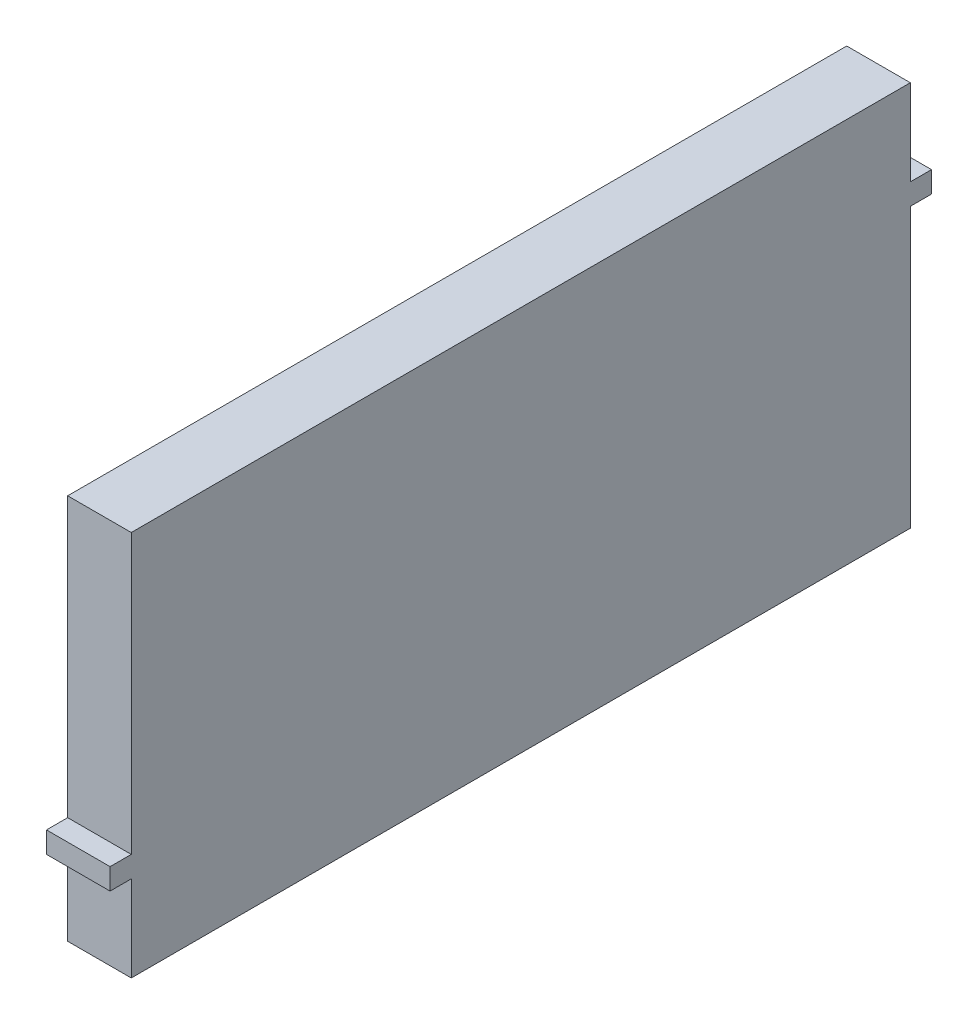
ISO-10303-21;
HEADER;
FILE_DESCRIPTION(('STEP AP214'),'2;1');
FILE_NAME('part.step','',(''),(''),'','','');
FILE_SCHEMA(('AUTOMOTIVE_DESIGN { 1 0 10303 214 1 1 1 1 }'));
ENDSEC;
DATA;
#1=APPLICATION_CONTEXT('core data for automotive mechanical design processes');
#2=APPLICATION_PROTOCOL_DEFINITION('international standard','automotive_design',2000,#1);
#3=PRODUCT_CONTEXT('',#1,'mechanical');
#4=PRODUCT('Part','Part','',(#3));
#5=PRODUCT_RELATED_PRODUCT_CATEGORY('part','',(#4));
#6=PRODUCT_DEFINITION_FORMATION('','',#4);
#7=PRODUCT_DEFINITION_CONTEXT('part definition',#1,'design');
#8=PRODUCT_DEFINITION('design','',#6,#7);
#9=PRODUCT_DEFINITION_SHAPE('','',#8);
#10=(LENGTH_UNIT() NAMED_UNIT(*) SI_UNIT(.MILLI.,.METRE.));
#11=(NAMED_UNIT(*) PLANE_ANGLE_UNIT() SI_UNIT($,.RADIAN.));
#12=(NAMED_UNIT(*) SI_UNIT($,.STERADIAN.) SOLID_ANGLE_UNIT());
#13=UNCERTAINTY_MEASURE_WITH_UNIT(LENGTH_MEASURE(1.E-05),#10,'distance_accuracy_value','');
#14=(GEOMETRIC_REPRESENTATION_CONTEXT(3) GLOBAL_UNCERTAINTY_ASSIGNED_CONTEXT((#13)) GLOBAL_UNIT_ASSIGNED_CONTEXT((#10,
#11,#12)) REPRESENTATION_CONTEXT('',''));
#15=CARTESIAN_POINT('',(0.,0.,0.));
#16=DIRECTION('',(0.,0.,1.));
#17=DIRECTION('',(1.,0.,0.));
#18=AXIS2_PLACEMENT_3D('',#15,#16,#17);
#19=CARTESIAN_POINT('',(388.468402146903,403.484208454733,319.68119407791));
#20=DIRECTION('',(0.,0.,1.));
#21=DIRECTION('',(1.,0.,0.));
#22=AXIS2_PLACEMENT_3D('',#19,#20,#21);
#23=PLANE('',#22);
#24=DIRECTION('',(0.,1.,0.));
#25=VECTOR('',#24,1.);
#26=CARTESIAN_POINT('',(252.542706630704,403.484208454733,319.68119407791));
#27=LINE('',#26,#25);
#28=CARTESIAN_POINT('',(252.542706630704,403.484208454733,319.68119407791));
#29=VERTEX_POINT('',#28);
#30=CARTESIAN_POINT('',(252.542706630704,406.659208454733,319.68119407791));
#31=VERTEX_POINT('',#30);
#32=EDGE_CURVE('E168',#29,#31,#27,.T.);
#33=ORIENTED_EDGE('',*,*,#32,.F.);
#34=DIRECTION('',(-1.,0.,0.));
#35=VECTOR('',#34,1.);
#36=CARTESIAN_POINT('',(388.468402146903,403.484208454733,319.68119407791));
#37=LINE('',#36,#35);
#38=CARTESIAN_POINT('',(243.017706630704,403.484208454733,319.68119407791));
#39=VERTEX_POINT('',#38);
#40=EDGE_CURVE('E37',#29,#39,#37,.T.);
#41=ORIENTED_EDGE('',*,*,#40,.T.);
#42=DIRECTION('',(0.,1.,0.));
#43=VECTOR('',#42,1.);
#44=CARTESIAN_POINT('',(243.017706630704,403.484208454733,319.68119407791));
#45=LINE('',#44,#43);
#46=CARTESIAN_POINT('',(243.017706630704,406.659208454733,319.68119407791));
#47=VERTEX_POINT('',#46);
#48=EDGE_CURVE('E176',#39,#47,#45,.T.);
#49=ORIENTED_EDGE('',*,*,#48,.T.);
#50=DIRECTION('',(-1.,0.,0.));
#51=VECTOR('',#50,1.);
#52=CARTESIAN_POINT('',(388.468402146903,406.659208454733,319.68119407791));
#53=LINE('',#52,#51);
#54=EDGE_CURVE('E104',#31,#47,#53,.T.);
#55=ORIENTED_EDGE('',*,*,#54,.F.);
#56=EDGE_LOOP('',(#33,#41,#49,#55));
#57=FACE_BOUND('',#56,.T.);
#58=ADVANCED_FACE('F33',(#57),#23,.F.);
#59=CARTESIAN_POINT('',(388.468402146903,406.659208454733,319.68119407791));
#60=DIRECTION('',(0.,-1.,0.));
#61=DIRECTION('',(0.,0.,-1.));
#62=AXIS2_PLACEMENT_3D('',#59,#60,#61);
#63=PLANE('',#62);
#64=DIRECTION('',(0.,0.,1.));
#65=VECTOR('',#64,1.);
#66=CARTESIAN_POINT('',(252.542706630704,406.659208454733,319.68119407791));
#67=LINE('',#66,#65);
#68=CARTESIAN_POINT('',(252.542706630704,406.659208454733,322.85619407791));
#69=VERTEX_POINT('',#68);
#70=EDGE_CURVE('E111',#31,#69,#67,.T.);
#71=ORIENTED_EDGE('',*,*,#70,.F.);
#72=ORIENTED_EDGE('',*,*,#54,.T.);
#73=DIRECTION('',(0.,0.,1.));
#74=VECTOR('',#73,1.);
#75=CARTESIAN_POINT('',(243.017706630704,406.659208454733,319.68119407791));
#76=LINE('',#75,#74);
#77=CARTESIAN_POINT('',(243.017706630704,406.659208454733,322.85619407791));
#78=VERTEX_POINT('',#77);
#79=EDGE_CURVE('E175',#47,#78,#76,.T.);
#80=ORIENTED_EDGE('',*,*,#79,.T.);
#81=DIRECTION('',(-1.,0.,0.));
#82=VECTOR('',#81,1.);
#83=CARTESIAN_POINT('',(388.468402146903,406.659208454733,322.85619407791));
#84=LINE('',#83,#82);
#85=EDGE_CURVE('E177',#69,#78,#84,.T.);
#86=ORIENTED_EDGE('',*,*,#85,.F.);
#87=EDGE_LOOP('',(#71,#72,#80,#86));
#88=FACE_BOUND('',#87,.T.);
#89=ADVANCED_FACE('F226',(#88),#63,.F.);
#90=CARTESIAN_POINT('',(388.468402146903,406.659208454733,322.85619407791));
#91=DIRECTION('',(0.,0.,1.));
#92=DIRECTION('',(0.,-1.,0.));
#93=AXIS2_PLACEMENT_3D('',#90,#91,#92);
#94=PLANE('',#93);
#95=DIRECTION('',(0.,1.,0.));
#96=VECTOR('',#95,1.);
#97=CARTESIAN_POINT('',(252.542706630704,406.659208454733,322.85619407791));
#98=LINE('',#97,#96);
#99=CARTESIAN_POINT('',(252.542706630704,419.517958454733,322.85619407791));
#100=VERTEX_POINT('',#99);
#101=EDGE_CURVE('E164',#69,#100,#98,.T.);
#102=ORIENTED_EDGE('',*,*,#101,.F.);
#103=ORIENTED_EDGE('',*,*,#85,.T.);
#104=DIRECTION('',(0.,1.,0.));
#105=VECTOR('',#104,1.);
#106=CARTESIAN_POINT('',(243.017706630704,406.659208454733,322.85619407791));
#107=LINE('',#106,#105);
#108=CARTESIAN_POINT('',(243.017706630704,419.517958454733,322.85619407791));
#109=VERTEX_POINT('',#108);
#110=EDGE_CURVE('E179',#78,#109,#107,.T.);
#111=ORIENTED_EDGE('',*,*,#110,.T.);
#112=DIRECTION('',(-1.,0.,0.));
#113=VECTOR('',#112,1.);
#114=CARTESIAN_POINT('',(388.468402146903,419.517958454733,322.85619407791));
#115=LINE('',#114,#113);
#116=EDGE_CURVE('E180',#100,#109,#115,.T.);
#117=ORIENTED_EDGE('',*,*,#116,.F.);
#118=EDGE_LOOP('',(#102,#103,#111,#117));
#119=FACE_BOUND('',#118,.T.);
#120=ADVANCED_FACE('F229',(#119),#94,.F.);
#121=CARTESIAN_POINT('',(388.468402146903,419.517958454733,439.53744407791));
#122=DIRECTION('',(0.,-1.,0.));
#123=DIRECTION('',(0.,0.,-1.));
#124=AXIS2_PLACEMENT_3D('',#121,#122,#123);
#125=PLANE('',#124);
#126=DIRECTION('',(0.,0.,1.));
#127=VECTOR('',#126,1.);
#128=CARTESIAN_POINT('',(252.542706630704,419.517958454733,439.53744407791));
#129=LINE('',#128,#127);
#130=CARTESIAN_POINT('',(252.542706630704,419.517958454733,439.53744407791));
#131=VERTEX_POINT('',#130);
#132=EDGE_CURVE('E161',#100,#131,#129,.T.);
#133=ORIENTED_EDGE('',*,*,#132,.F.);
#134=ORIENTED_EDGE('',*,*,#116,.T.);
#135=DIRECTION('',(0.,0.,1.));
#136=VECTOR('',#135,1.);
#137=CARTESIAN_POINT('',(243.017706630704,419.517958454733,439.53744407791));
#138=LINE('',#137,#136);
#139=CARTESIAN_POINT('',(243.017706630704,419.517958454733,439.53744407791));
#140=VERTEX_POINT('',#139);
#141=EDGE_CURVE('E182',#109,#140,#138,.T.);
#142=ORIENTED_EDGE('',*,*,#141,.T.);
#143=DIRECTION('',(-1.,0.,0.));
#144=VECTOR('',#143,1.);
#145=CARTESIAN_POINT('',(388.468402146903,419.517958454733,439.53744407791));
#146=LINE('',#145,#144);
#147=EDGE_CURVE('E183',#131,#140,#146,.T.);
#148=ORIENTED_EDGE('',*,*,#147,.F.);
#149=EDGE_LOOP('',(#133,#134,#142,#148));
#150=FACE_BOUND('',#149,.T.);
#151=ADVANCED_FACE('F231',(#150),#125,.F.);
#152=CARTESIAN_POINT('',(388.468402146903,419.517958454733,439.53744407791));
#153=DIRECTION('',(0.,0.,-1.));
#154=DIRECTION('',(-1.,0.,0.));
#155=AXIS2_PLACEMENT_3D('',#152,#153,#154);
#156=PLANE('',#155);
#157=DIRECTION('',(0.,-1.,0.));
#158=VECTOR('',#157,1.);
#159=CARTESIAN_POINT('',(252.542706630704,419.517958454733,439.53744407791));
#160=LINE('',#159,#158);
#161=CARTESIAN_POINT('',(252.542706630704,377.766708454733,439.53744407791));
#162=VERTEX_POINT('',#161);
#163=EDGE_CURVE('E158',#131,#162,#160,.T.);
#164=ORIENTED_EDGE('',*,*,#163,.F.);
#165=ORIENTED_EDGE('',*,*,#147,.T.);
#166=DIRECTION('',(0.,-1.,0.));
#167=VECTOR('',#166,1.);
#168=CARTESIAN_POINT('',(243.017706630704,419.517958454733,439.53744407791));
#169=LINE('',#168,#167);
#170=CARTESIAN_POINT('',(243.017706630704,377.766708454733,439.53744407791));
#171=VERTEX_POINT('',#170);
#172=EDGE_CURVE('E185',#140,#171,#169,.T.);
#173=ORIENTED_EDGE('',*,*,#172,.T.);
#174=DIRECTION('',(-1.,0.,0.));
#175=VECTOR('',#174,1.);
#176=CARTESIAN_POINT('',(388.468402146903,377.766708454733,439.53744407791));
#177=LINE('',#176,#175);
#178=EDGE_CURVE('E186',#162,#171,#177,.T.);
#179=ORIENTED_EDGE('',*,*,#178,.F.);
#180=EDGE_LOOP('',(#164,#165,#173,#179));
#181=FACE_BOUND('',#180,.T.);
#182=ADVANCED_FACE('F235',(#181),#156,.F.);
#183=CARTESIAN_POINT('',(388.468402146903,377.766708454733,439.53744407791));
#184=DIRECTION('',(0.,-1.,0.));
#185=DIRECTION('',(0.,0.,-1.));
#186=AXIS2_PLACEMENT_3D('',#183,#184,#185);
#187=PLANE('',#186);
#188=DIRECTION('',(0.,0.,1.));
#189=VECTOR('',#188,1.);
#190=CARTESIAN_POINT('',(252.542706630704,377.766708454733,439.53744407791));
#191=LINE('',#190,#189);
#192=CARTESIAN_POINT('',(252.542706630704,377.766708454733,442.71244407791));
#193=VERTEX_POINT('',#192);
#194=EDGE_CURVE('E155',#162,#193,#191,.T.);
#195=ORIENTED_EDGE('',*,*,#194,.F.);
#196=ORIENTED_EDGE('',*,*,#178,.T.);
#197=DIRECTION('',(0.,0.,1.));
#198=VECTOR('',#197,1.);
#199=CARTESIAN_POINT('',(243.017706630704,377.766708454733,439.53744407791));
#200=LINE('',#199,#198);
#201=CARTESIAN_POINT('',(243.017706630704,377.766708454733,442.71244407791));
#202=VERTEX_POINT('',#201);
#203=EDGE_CURVE('E188',#171,#202,#200,.T.);
#204=ORIENTED_EDGE('',*,*,#203,.T.);
#205=DIRECTION('',(-1.,0.,0.));
#206=VECTOR('',#205,1.);
#207=CARTESIAN_POINT('',(388.468402146903,377.766708454733,442.71244407791));
#208=LINE('',#207,#206);
#209=EDGE_CURVE('E189',#193,#202,#208,.T.);
#210=ORIENTED_EDGE('',*,*,#209,.F.);
#211=EDGE_LOOP('',(#195,#196,#204,#210));
#212=FACE_BOUND('',#211,.T.);
#213=ADVANCED_FACE('F240',(#212),#187,.F.);
#214=CARTESIAN_POINT('',(388.468402146903,377.766708454733,442.71244407791));
#215=DIRECTION('',(0.,0.,-1.));
#216=DIRECTION('',(-1.,0.,0.));
#217=AXIS2_PLACEMENT_3D('',#214,#215,#216);
#218=PLANE('',#217);
#219=DIRECTION('',(0.,-1.,0.));
#220=VECTOR('',#219,1.);
#221=CARTESIAN_POINT('',(252.542706630704,377.766708454733,442.71244407791));
#222=LINE('',#221,#220);
#223=CARTESIAN_POINT('',(252.542706630704,374.591708454733,442.71244407791));
#224=VERTEX_POINT('',#223);
#225=EDGE_CURVE('E152',#193,#224,#222,.T.);
#226=ORIENTED_EDGE('',*,*,#225,.F.);
#227=ORIENTED_EDGE('',*,*,#209,.T.);
#228=DIRECTION('',(0.,-1.,0.));
#229=VECTOR('',#228,1.);
#230=CARTESIAN_POINT('',(243.017706630704,377.766708454733,442.71244407791));
#231=LINE('',#230,#229);
#232=CARTESIAN_POINT('',(243.017706630704,374.591708454733,442.71244407791));
#233=VERTEX_POINT('',#232);
#234=EDGE_CURVE('E191',#202,#233,#231,.T.);
#235=ORIENTED_EDGE('',*,*,#234,.T.);
#236=DIRECTION('',(-1.,0.,0.));
#237=VECTOR('',#236,1.);
#238=CARTESIAN_POINT('',(388.468402146903,374.591708454733,442.71244407791));
#239=LINE('',#238,#237);
#240=EDGE_CURVE('E192',#224,#233,#239,.T.);
#241=ORIENTED_EDGE('',*,*,#240,.F.);
#242=EDGE_LOOP('',(#226,#227,#235,#241));
#243=FACE_BOUND('',#242,.T.);
#244=ADVANCED_FACE('F243',(#243),#218,.F.);
#245=CARTESIAN_POINT('',(388.468402146903,374.591708454733,442.71244407791));
#246=DIRECTION('',(0.,1.,0.));
#247=DIRECTION('',(0.,0.,1.));
#248=AXIS2_PLACEMENT_3D('',#245,#246,#247);
#249=PLANE('',#248);
#250=DIRECTION('',(0.,0.,-1.));
#251=VECTOR('',#250,1.);
#252=CARTESIAN_POINT('',(252.542706630704,374.591708454733,442.71244407791));
#253=LINE('',#252,#251);
#254=CARTESIAN_POINT('',(252.542706630704,374.591708454733,439.53744407791));
#255=VERTEX_POINT('',#254);
#256=EDGE_CURVE('E147',#224,#255,#253,.T.);
#257=ORIENTED_EDGE('',*,*,#256,.F.);
#258=ORIENTED_EDGE('',*,*,#240,.T.);
#259=DIRECTION('',(0.,0.,-1.));
#260=VECTOR('',#259,1.);
#261=CARTESIAN_POINT('',(243.017706630704,374.591708454733,442.71244407791));
#262=LINE('',#261,#260);
#263=CARTESIAN_POINT('',(243.017706630704,374.591708454733,439.53744407791));
#264=VERTEX_POINT('',#263);
#265=EDGE_CURVE('E194',#233,#264,#262,.T.);
#266=ORIENTED_EDGE('',*,*,#265,.T.);
#267=DIRECTION('',(-1.,0.,0.));
#268=VECTOR('',#267,1.);
#269=CARTESIAN_POINT('',(388.468402146903,374.591708454733,439.53744407791));
#270=LINE('',#269,#268);
#271=EDGE_CURVE('E195',#255,#264,#270,.T.);
#272=ORIENTED_EDGE('',*,*,#271,.F.);
#273=EDGE_LOOP('',(#257,#258,#266,#272));
#274=FACE_BOUND('',#273,.T.);
#275=ADVANCED_FACE('F247',(#274),#249,.F.);
#276=CARTESIAN_POINT('',(388.468402146903,374.591708454733,439.53744407791));
#277=DIRECTION('',(0.,0.,-1.));
#278=DIRECTION('',(-1.,0.,0.));
#279=AXIS2_PLACEMENT_3D('',#276,#277,#278);
#280=PLANE('',#279);
#281=DIRECTION('',(0.,-1.,0.));
#282=VECTOR('',#281,1.);
#283=CARTESIAN_POINT('',(252.542706630704,374.591708454733,439.53744407791));
#284=LINE('',#283,#282);
#285=CARTESIAN_POINT('',(252.542706630704,361.732958454733,439.53744407791));
#286=VERTEX_POINT('',#285);
#287=EDGE_CURVE('E145',#255,#286,#284,.T.);
#288=ORIENTED_EDGE('',*,*,#287,.F.);
#289=ORIENTED_EDGE('',*,*,#271,.T.);
#290=DIRECTION('',(0.,-1.,0.));
#291=VECTOR('',#290,1.);
#292=CARTESIAN_POINT('',(243.017706630704,374.591708454733,439.53744407791));
#293=LINE('',#292,#291);
#294=CARTESIAN_POINT('',(243.017706630704,361.732958454733,439.53744407791));
#295=VERTEX_POINT('',#294);
#296=EDGE_CURVE('E197',#264,#295,#293,.T.);
#297=ORIENTED_EDGE('',*,*,#296,.T.);
#298=DIRECTION('',(-1.,0.,0.));
#299=VECTOR('',#298,1.);
#300=CARTESIAN_POINT('',(388.468402146903,361.732958454733,439.53744407791));
#301=LINE('',#300,#299);
#302=EDGE_CURVE('E198',#286,#295,#301,.T.);
#303=ORIENTED_EDGE('',*,*,#302,.F.);
#304=EDGE_LOOP('',(#288,#289,#297,#303));
#305=FACE_BOUND('',#304,.T.);
#306=ADVANCED_FACE('F251',(#305),#280,.F.);
#307=CARTESIAN_POINT('',(388.468402146903,361.732958454733,439.53744407791));
#308=DIRECTION('',(0.,1.,0.));
#309=DIRECTION('',(0.,0.,1.));
#310=AXIS2_PLACEMENT_3D('',#307,#308,#309);
#311=PLANE('',#310);
#312=DIRECTION('',(0.,0.,-1.));
#313=VECTOR('',#312,1.);
#314=CARTESIAN_POINT('',(252.542706630704,361.732958454733,439.53744407791));
#315=LINE('',#314,#313);
#316=CARTESIAN_POINT('',(252.542706630704,361.732958454733,322.85619407791));
#317=VERTEX_POINT('',#316);
#318=EDGE_CURVE('E42',#286,#317,#315,.T.);
#319=ORIENTED_EDGE('',*,*,#318,.F.);
#320=ORIENTED_EDGE('',*,*,#302,.T.);
#321=DIRECTION('',(0.,0.,-1.));
#322=VECTOR('',#321,1.);
#323=CARTESIAN_POINT('',(243.017706630704,361.732958454733,439.53744407791));
#324=LINE('',#323,#322);
#325=CARTESIAN_POINT('',(243.017706630704,361.732958454733,322.85619407791));
#326=VERTEX_POINT('',#325);
#327=EDGE_CURVE('E139',#295,#326,#324,.T.);
#328=ORIENTED_EDGE('',*,*,#327,.T.);
#329=DIRECTION('',(-1.,0.,0.));
#330=VECTOR('',#329,1.);
#331=CARTESIAN_POINT('',(388.468402146903,361.732958454733,322.85619407791));
#332=LINE('',#331,#330);
#333=EDGE_CURVE('E130',#317,#326,#332,.T.);
#334=ORIENTED_EDGE('',*,*,#333,.F.);
#335=EDGE_LOOP('',(#319,#320,#328,#334));
#336=FACE_BOUND('',#335,.T.);
#337=ADVANCED_FACE('F136',(#336),#311,.F.);
#338=CARTESIAN_POINT('',(388.468402146903,361.732958454733,322.85619407791));
#339=DIRECTION('',(0.,0.,1.));
#340=DIRECTION('',(1.,0.,0.));
#341=AXIS2_PLACEMENT_3D('',#338,#339,#340);
#342=PLANE('',#341);
#343=DIRECTION('',(0.,1.,0.));
#344=VECTOR('',#343,1.);
#345=CARTESIAN_POINT('',(252.542706630704,361.732958454733,322.85619407791));
#346=LINE('',#345,#344);
#347=CARTESIAN_POINT('',(252.542706630704,403.484208454733,322.85619407791));
#348=VERTEX_POINT('',#347);
#349=EDGE_CURVE('E11',#317,#348,#346,.T.);
#350=ORIENTED_EDGE('',*,*,#349,.F.);
#351=ORIENTED_EDGE('',*,*,#333,.T.);
#352=DIRECTION('',(0.,1.,0.));
#353=VECTOR('',#352,1.);
#354=CARTESIAN_POINT('',(243.017706630704,361.732958454733,322.85619407791));
#355=LINE('',#354,#353);
#356=CARTESIAN_POINT('',(243.017706630704,403.484208454733,322.85619407791));
#357=VERTEX_POINT('',#356);
#358=EDGE_CURVE('E141',#326,#357,#355,.T.);
#359=ORIENTED_EDGE('',*,*,#358,.T.);
#360=DIRECTION('',(-1.,0.,0.));
#361=VECTOR('',#360,1.);
#362=CARTESIAN_POINT('',(388.468402146903,403.484208454733,322.85619407791));
#363=LINE('',#362,#361);
#364=EDGE_CURVE('E55',#348,#357,#363,.T.);
#365=ORIENTED_EDGE('',*,*,#364,.F.);
#366=EDGE_LOOP('',(#350,#351,#359,#365));
#367=FACE_BOUND('',#366,.T.);
#368=ADVANCED_FACE('F129',(#367),#342,.F.);
#369=CARTESIAN_POINT('',(388.468402146903,403.484208454733,322.85619407791));
#370=DIRECTION('',(0.,1.,0.));
#371=DIRECTION('',(0.,0.,1.));
#372=AXIS2_PLACEMENT_3D('',#369,#370,#371);
#373=PLANE('',#372);
#374=DIRECTION('',(0.,0.,-1.));
#375=VECTOR('',#374,1.);
#376=CARTESIAN_POINT('',(252.542706630704,403.484208454733,322.85619407791));
#377=LINE('',#376,#375);
#378=EDGE_CURVE('E171',#348,#29,#377,.T.);
#379=ORIENTED_EDGE('',*,*,#378,.F.);
#380=ORIENTED_EDGE('',*,*,#364,.T.);
#381=DIRECTION('',(0.,0.,-1.));
#382=VECTOR('',#381,1.);
#383=CARTESIAN_POINT('',(243.017706630704,403.484208454733,322.85619407791));
#384=LINE('',#383,#382);
#385=EDGE_CURVE('E173',#357,#39,#384,.T.);
#386=ORIENTED_EDGE('',*,*,#385,.T.);
#387=ORIENTED_EDGE('',*,*,#40,.F.);
#388=EDGE_LOOP('',(#379,#380,#386,#387));
#389=FACE_BOUND('',#388,.T.);
#390=ADVANCED_FACE('F221',(#389),#373,.F.);
#391=CARTESIAN_POINT('',(243.017706630704,0.,0.));
#392=DIRECTION('',(1.,0.,0.));
#393=DIRECTION('',(0.,0.,-1.));
#394=AXIS2_PLACEMENT_3D('',#391,#392,#393);
#395=PLANE('',#394);
#396=ORIENTED_EDGE('',*,*,#48,.F.);
#397=ORIENTED_EDGE('',*,*,#385,.F.);
#398=ORIENTED_EDGE('',*,*,#358,.F.);
#399=ORIENTED_EDGE('',*,*,#327,.F.);
#400=ORIENTED_EDGE('',*,*,#296,.F.);
#401=ORIENTED_EDGE('',*,*,#265,.F.);
#402=ORIENTED_EDGE('',*,*,#234,.F.);
#403=ORIENTED_EDGE('',*,*,#203,.F.);
#404=ORIENTED_EDGE('',*,*,#172,.F.);
#405=ORIENTED_EDGE('',*,*,#141,.F.);
#406=ORIENTED_EDGE('',*,*,#110,.F.);
#407=ORIENTED_EDGE('',*,*,#79,.F.);
#408=EDGE_LOOP('',(#396,#397,#398,#399,#400,#401,#402,#403,#404,#405,#406,#407));
#409=FACE_BOUND('',#408,.T.);
#410=ADVANCED_FACE('F223',(#409),#395,.F.);
#411=CARTESIAN_POINT('',(252.542706630704,403.484208454733,802.28119407791));
#412=DIRECTION('',(1.,0.,0.));
#413=DIRECTION('',(0.,0.,-1.));
#414=AXIS2_PLACEMENT_3D('',#411,#412,#413);
#415=PLANE('',#414);
#416=ORIENTED_EDGE('',*,*,#378,.T.);
#417=ORIENTED_EDGE('',*,*,#32,.T.);
#418=ORIENTED_EDGE('',*,*,#70,.T.);
#419=ORIENTED_EDGE('',*,*,#101,.T.);
#420=ORIENTED_EDGE('',*,*,#132,.T.);
#421=ORIENTED_EDGE('',*,*,#163,.T.);
#422=ORIENTED_EDGE('',*,*,#194,.T.);
#423=ORIENTED_EDGE('',*,*,#225,.T.);
#424=ORIENTED_EDGE('',*,*,#256,.T.);
#425=ORIENTED_EDGE('',*,*,#287,.T.);
#426=ORIENTED_EDGE('',*,*,#318,.T.);
#427=ORIENTED_EDGE('',*,*,#349,.T.);
#428=EDGE_LOOP('',(#416,#417,#418,#419,#420,#421,#422,#423,#424,#425,#426,#427));
#429=FACE_BOUND('',#428,.T.);
#430=ADVANCED_FACE('F35',(#429),#415,.T.);
#431=CLOSED_SHELL('',(#58,#89,#120,#151,#182,#213,#244,#275,#306,#337,#368,#390,#410,#430));
#432=MANIFOLD_SOLID_BREP('B2',#431);
#433=ADVANCED_BREP_SHAPE_REPRESENTATION('',(#18,#432),#14);
#434=SHAPE_DEFINITION_REPRESENTATION(#9,#433);
ENDSEC;
END-ISO-10303-21;
